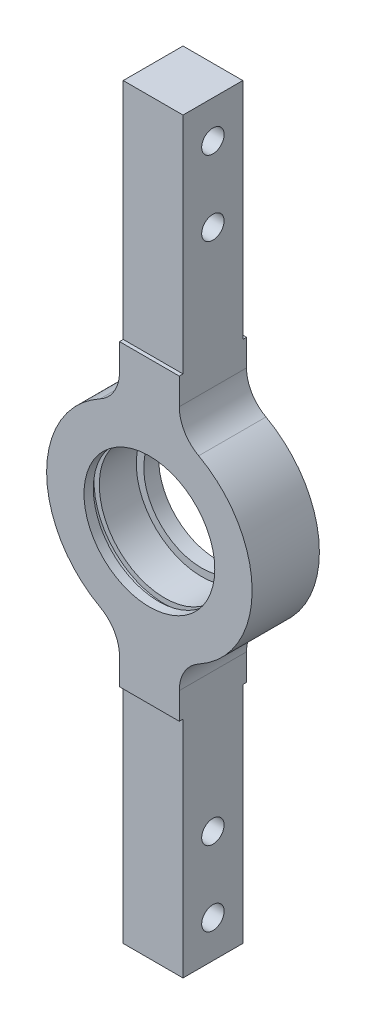
ISO-10303-21;
HEADER;
FILE_DESCRIPTION(('STEP AP214'),'2;1');
FILE_NAME('part.step','',(''),(''),'','','');
FILE_SCHEMA(('AUTOMOTIVE_DESIGN { 1 0 10303 214 1 1 1 1 }'));
ENDSEC;
DATA;
#1=APPLICATION_CONTEXT('core data for automotive mechanical design processes');
#2=APPLICATION_PROTOCOL_DEFINITION('international standard','automotive_design',2000,#1);
#3=PRODUCT_CONTEXT('',#1,'mechanical');
#4=PRODUCT('Part','Part','',(#3));
#5=PRODUCT_RELATED_PRODUCT_CATEGORY('part','',(#4));
#6=PRODUCT_DEFINITION_FORMATION('','',#4);
#7=PRODUCT_DEFINITION_CONTEXT('part definition',#1,'design');
#8=PRODUCT_DEFINITION('design','',#6,#7);
#9=PRODUCT_DEFINITION_SHAPE('','',#8);
#10=(LENGTH_UNIT() NAMED_UNIT(*) SI_UNIT(.MILLI.,.METRE.));
#11=(NAMED_UNIT(*) PLANE_ANGLE_UNIT() SI_UNIT($,.RADIAN.));
#12=(NAMED_UNIT(*) SI_UNIT($,.STERADIAN.) SOLID_ANGLE_UNIT());
#13=UNCERTAINTY_MEASURE_WITH_UNIT(LENGTH_MEASURE(1.E-05),#10,'distance_accuracy_value','');
#14=(GEOMETRIC_REPRESENTATION_CONTEXT(3) GLOBAL_UNCERTAINTY_ASSIGNED_CONTEXT((#13)) GLOBAL_UNIT_ASSIGNED_CONTEXT((#10,
#11,#12)) REPRESENTATION_CONTEXT('',''));
#15=CARTESIAN_POINT('',(0.,0.,0.));
#16=DIRECTION('',(0.,0.,1.));
#17=DIRECTION('',(1.,0.,0.));
#18=AXIS2_PLACEMENT_3D('',#15,#16,#17);
#19=CARTESIAN_POINT('',(8.,100.,9.));
#20=DIRECTION('',(-1.,0.,0.));
#21=DIRECTION('',(0.,-1.,0.));
#22=AXIS2_PLACEMENT_3D('',#19,#20,#21);
#23=PLANE('',#22);
#24=CARTESIAN_POINT('',(8.,70.,0.));
#25=DIRECTION('',(-1.,0.,0.));
#26=DIRECTION('',(0.,-1.,0.));
#27=AXIS2_PLACEMENT_3D('',#24,#25,#26);
#28=CIRCLE('',#27,3.);
#29=CARTESIAN_POINT('',(8.,67.,0.));
#30=VERTEX_POINT('',#29);
#31=EDGE_CURVE('E226',#30,#30,#28,.T.);
#32=ORIENTED_EDGE('',*,*,#31,.T.);
#33=EDGE_LOOP('',(#32));
#34=FACE_BOUND('',#33,.T.);
#35=CARTESIAN_POINT('',(8.,90.,0.));
#36=DIRECTION('',(-1.,0.,0.));
#37=DIRECTION('',(0.,-1.,0.));
#38=AXIS2_PLACEMENT_3D('',#35,#36,#37);
#39=CIRCLE('',#38,3.);
#40=CARTESIAN_POINT('',(8.,87.,0.));
#41=VERTEX_POINT('',#40);
#42=EDGE_CURVE('E232',#41,#41,#39,.T.);
#43=ORIENTED_EDGE('',*,*,#42,.T.);
#44=EDGE_LOOP('',(#43));
#45=FACE_BOUND('',#44,.T.);
#46=DIRECTION('',(0.,1.,0.));
#47=VECTOR('',#46,1.);
#48=CARTESIAN_POINT('',(8.,40.,-8.));
#49=LINE('',#48,#47);
#50=CARTESIAN_POINT('',(8.,40.,-8.));
#51=VERTEX_POINT('',#50);
#52=CARTESIAN_POINT('',(8.,100.,-8.));
#53=VERTEX_POINT('',#52);
#54=EDGE_CURVE('E175',#51,#53,#49,.T.);
#55=ORIENTED_EDGE('',*,*,#54,.T.);
#56=DIRECTION('',(0.,0.,-1.));
#57=VECTOR('',#56,1.);
#58=CARTESIAN_POINT('',(8.,100.,9.));
#59=LINE('',#58,#57);
#60=CARTESIAN_POINT('',(8.,100.,8.));
#61=VERTEX_POINT('',#60);
#62=EDGE_CURVE('E312',#61,#53,#59,.T.);
#63=ORIENTED_EDGE('',*,*,#62,.F.);
#64=DIRECTION('',(0.,1.,0.));
#65=VECTOR('',#64,1.);
#66=CARTESIAN_POINT('',(8.,40.,8.));
#67=LINE('',#66,#65);
#68=CARTESIAN_POINT('',(8.,40.,8.));
#69=VERTEX_POINT('',#68);
#70=EDGE_CURVE('E206',#69,#61,#67,.T.);
#71=ORIENTED_EDGE('',*,*,#70,.F.);
#72=DIRECTION('',(0.,0.,1.));
#73=VECTOR('',#72,1.);
#74=CARTESIAN_POINT('',(8.,40.,9.));
#75=LINE('',#74,#73);
#76=CARTESIAN_POINT('',(8.,40.,9.));
#77=VERTEX_POINT('',#76);
#78=EDGE_CURVE('E201',#69,#77,#75,.T.);
#79=ORIENTED_EDGE('',*,*,#78,.T.);
#80=DIRECTION('',(0.,1.,0.));
#81=VECTOR('',#80,1.);
#82=CARTESIAN_POINT('',(8.,100.,9.));
#83=LINE('',#82,#81);
#84=CARTESIAN_POINT('',(8.00000000000001,32.897568299192,9.));
#85=VERTEX_POINT('',#84);
#86=EDGE_CURVE('E302',#85,#77,#83,.T.);
#87=ORIENTED_EDGE('',*,*,#86,.F.);
#88=DIRECTION('',(0.,0.,1.));
#89=VECTOR('',#88,1.);
#90=CARTESIAN_POINT('',(8.00000000000001,32.897568299192,-9.));
#91=LINE('',#90,#89);
#92=CARTESIAN_POINT('',(8.00000000000001,32.897568299192,-9.));
#93=VERTEX_POINT('',#92);
#94=EDGE_CURVE('E348',#85,#93,#91,.F.);
#95=ORIENTED_EDGE('',*,*,#94,.T.);
#96=DIRECTION('',(0.,1.,0.));
#97=VECTOR('',#96,1.);
#98=CARTESIAN_POINT('',(8.,100.,-9.));
#99=LINE('',#98,#97);
#100=CARTESIAN_POINT('',(8.00000000000001,40.,-9.));
#101=VERTEX_POINT('',#100);
#102=EDGE_CURVE('E301',#93,#101,#99,.T.);
#103=ORIENTED_EDGE('',*,*,#102,.T.);
#104=DIRECTION('',(0.,0.,1.));
#105=VECTOR('',#104,1.);
#106=CARTESIAN_POINT('',(8.,40.,-9.));
#107=LINE('',#106,#105);
#108=EDGE_CURVE('E48',#101,#51,#107,.T.);
#109=ORIENTED_EDGE('',*,*,#108,.T.);
#110=EDGE_LOOP('',(#55,#63,#71,#79,#87,#95,#103,#109));
#111=FACE_BOUND('',#110,.T.);
#112=ADVANCED_FACE('F33',(#34,#45,#111),#23,.F.);
#113=CARTESIAN_POINT('',(-8.,100.,9.));
#114=DIRECTION('',(0.,-1.,0.));
#115=DIRECTION('',(0.,0.,-1.));
#116=AXIS2_PLACEMENT_3D('',#113,#114,#115);
#117=PLANE('',#116);
#118=DIRECTION('',(-1.,0.,0.));
#119=VECTOR('',#118,1.);
#120=CARTESIAN_POINT('',(-8.,100.,-8.));
#121=LINE('',#120,#119);
#122=CARTESIAN_POINT('',(-8.,100.,-8.));
#123=VERTEX_POINT('',#122);
#124=EDGE_CURVE('E183',#53,#123,#121,.T.);
#125=ORIENTED_EDGE('',*,*,#124,.T.);
#126=DIRECTION('',(0.,0.,-1.));
#127=VECTOR('',#126,1.);
#128=CARTESIAN_POINT('',(-8.,100.,9.));
#129=LINE('',#128,#127);
#130=CARTESIAN_POINT('',(-8.,100.,8.));
#131=VERTEX_POINT('',#130);
#132=EDGE_CURVE('E188',#131,#123,#129,.T.);
#133=ORIENTED_EDGE('',*,*,#132,.F.);
#134=DIRECTION('',(1.,0.,0.));
#135=VECTOR('',#134,1.);
#136=CARTESIAN_POINT('',(-8.,100.,8.));
#137=LINE('',#136,#135);
#138=EDGE_CURVE('E190',#131,#61,#137,.T.);
#139=ORIENTED_EDGE('',*,*,#138,.T.);
#140=ORIENTED_EDGE('',*,*,#62,.T.);
#141=EDGE_LOOP('',(#125,#133,#139,#140));
#142=FACE_BOUND('',#141,.T.);
#143=ADVANCED_FACE('F448',(#142),#117,.F.);
#144=CARTESIAN_POINT('',(-8.,100.,9.));
#145=DIRECTION('',(1.,0.,0.));
#146=DIRECTION('',(0.,1.,0.));
#147=AXIS2_PLACEMENT_3D('',#144,#145,#146);
#148=PLANE('',#147);
#149=CARTESIAN_POINT('',(-8.,70.,0.));
#150=DIRECTION('',(-1.,0.,0.));
#151=DIRECTION('',(0.,-1.,0.));
#152=AXIS2_PLACEMENT_3D('',#149,#150,#151);
#153=CIRCLE('',#152,3.);
#154=CARTESIAN_POINT('',(-8.,67.,0.));
#155=VERTEX_POINT('',#154);
#156=EDGE_CURVE('E223',#155,#155,#153,.T.);
#157=ORIENTED_EDGE('',*,*,#156,.F.);
#158=EDGE_LOOP('',(#157));
#159=FACE_BOUND('',#158,.T.);
#160=CARTESIAN_POINT('',(-8.,90.,0.));
#161=DIRECTION('',(-1.,0.,0.));
#162=DIRECTION('',(0.,-1.,0.));
#163=AXIS2_PLACEMENT_3D('',#160,#161,#162);
#164=CIRCLE('',#163,3.);
#165=CARTESIAN_POINT('',(-8.,87.,0.));
#166=VERTEX_POINT('',#165);
#167=EDGE_CURVE('E229',#166,#166,#164,.T.);
#168=ORIENTED_EDGE('',*,*,#167,.F.);
#169=EDGE_LOOP('',(#168));
#170=FACE_BOUND('',#169,.T.);
#171=DIRECTION('',(0.,1.,0.));
#172=VECTOR('',#171,1.);
#173=CARTESIAN_POINT('',(-8.,40.,-8.));
#174=LINE('',#173,#172);
#175=CARTESIAN_POINT('',(-8.,40.,-8.));
#176=VERTEX_POINT('',#175);
#177=EDGE_CURVE('E172',#176,#123,#174,.T.);
#178=ORIENTED_EDGE('',*,*,#177,.F.);
#179=DIRECTION('',(0.,0.,-1.));
#180=VECTOR('',#179,1.);
#181=CARTESIAN_POINT('',(-8.,40.,-9.));
#182=LINE('',#181,#180);
#183=CARTESIAN_POINT('',(-8.,40.,-9.));
#184=VERTEX_POINT('',#183);
#185=EDGE_CURVE('E176',#176,#184,#182,.T.);
#186=ORIENTED_EDGE('',*,*,#185,.T.);
#187=DIRECTION('',(0.,-1.,0.));
#188=VECTOR('',#187,1.);
#189=CARTESIAN_POINT('',(-8.,100.,-9.));
#190=LINE('',#189,#188);
#191=CARTESIAN_POINT('',(-8.00000000000001,32.897568299192,-9.));
#192=VERTEX_POINT('',#191);
#193=EDGE_CURVE('E306',#184,#192,#190,.T.);
#194=ORIENTED_EDGE('',*,*,#193,.T.);
#195=DIRECTION('',(0.,0.,1.));
#196=VECTOR('',#195,1.);
#197=CARTESIAN_POINT('',(-8.00000000000001,32.897568299192,9.));
#198=LINE('',#197,#196);
#199=CARTESIAN_POINT('',(-8.00000000000001,32.897568299192,9.));
#200=VERTEX_POINT('',#199);
#201=EDGE_CURVE('E345',#192,#200,#198,.T.);
#202=ORIENTED_EDGE('',*,*,#201,.T.);
#203=DIRECTION('',(0.,-1.,0.));
#204=VECTOR('',#203,1.);
#205=CARTESIAN_POINT('',(-8.,100.,9.));
#206=LINE('',#205,#204);
#207=CARTESIAN_POINT('',(-8.,40.,9.));
#208=VERTEX_POINT('',#207);
#209=EDGE_CURVE('E305',#208,#200,#206,.T.);
#210=ORIENTED_EDGE('',*,*,#209,.F.);
#211=DIRECTION('',(0.,0.,-1.));
#212=VECTOR('',#211,1.);
#213=CARTESIAN_POINT('',(-8.,40.,9.));
#214=LINE('',#213,#212);
#215=CARTESIAN_POINT('',(-8.00000000000001,40.,8.));
#216=VERTEX_POINT('',#215);
#217=EDGE_CURVE('E195',#208,#216,#214,.T.);
#218=ORIENTED_EDGE('',*,*,#217,.T.);
#219=DIRECTION('',(0.,1.,0.));
#220=VECTOR('',#219,1.);
#221=CARTESIAN_POINT('',(-8.,40.,8.));
#222=LINE('',#221,#220);
#223=EDGE_CURVE('E56',#216,#131,#222,.T.);
#224=ORIENTED_EDGE('',*,*,#223,.T.);
#225=ORIENTED_EDGE('',*,*,#132,.T.);
#226=EDGE_LOOP('',(#178,#186,#194,#202,#210,#218,#224,#225));
#227=FACE_BOUND('',#226,.T.);
#228=ADVANCED_FACE('F186',(#159,#170,#227),#148,.F.);
#229=CARTESIAN_POINT('',(0.,0.,9.));
#230=DIRECTION('',(0.,0.,1.));
#231=DIRECTION('',(1.,0.,0.));
#232=AXIS2_PLACEMENT_3D('',#229,#230,#231);
#233=PLANE('',#232);
#234=CARTESIAN_POINT('',(0.,0.,9.));
#235=DIRECTION('',(0.,0.,1.));
#236=DIRECTION('',(1.,0.,0.));
#237=AXIS2_PLACEMENT_3D('',#234,#235,#236);
#238=CIRCLE('',#237,17.5);
#239=CARTESIAN_POINT('',(17.5,0.,9.));
#240=VERTEX_POINT('',#239);
#241=EDGE_CURVE('E275',#240,#240,#238,.T.);
#242=ORIENTED_EDGE('',*,*,#241,.F.);
#243=EDGE_LOOP('',(#242));
#244=FACE_BOUND('',#243,.T.);
#245=ORIENTED_EDGE('',*,*,#86,.T.);
#246=DIRECTION('',(-1.,0.,0.));
#247=VECTOR('',#246,1.);
#248=CARTESIAN_POINT('',(-8.,40.,9.));
#249=LINE('',#248,#247);
#250=EDGE_CURVE('E198',#77,#208,#249,.T.);
#251=ORIENTED_EDGE('',*,*,#250,.T.);
#252=ORIENTED_EDGE('',*,*,#209,.T.);
#253=CARTESIAN_POINT('',(-18.,32.897568299192,9.));
#254=DIRECTION('',(0.,0.,1.));
#255=DIRECTION('',(1.,0.,0.));
#256=AXIS2_PLACEMENT_3D('',#253,#254,#255);
#257=CIRCLE('',#256,10.);
#258=CARTESIAN_POINT('',(-13.2,24.1248834194074,9.));
#259=VERTEX_POINT('',#258);
#260=EDGE_CURVE('E363',#200,#259,#257,.F.);
#261=ORIENTED_EDGE('',*,*,#260,.T.);
#262=CARTESIAN_POINT('',(0.,0.,9.));
#263=DIRECTION('',(0.,0.,1.));
#264=DIRECTION('',(1.,0.,0.));
#265=AXIS2_PLACEMENT_3D('',#262,#263,#264);
#266=CIRCLE('',#265,27.5);
#267=CARTESIAN_POINT('',(-13.2,-24.1248834194074,9.));
#268=VERTEX_POINT('',#267);
#269=EDGE_CURVE('E319',#259,#268,#266,.T.);
#270=ORIENTED_EDGE('',*,*,#269,.T.);
#271=CARTESIAN_POINT('',(-18.,-32.897568299192,9.));
#272=DIRECTION('',(0.,0.,1.));
#273=DIRECTION('',(1.,0.,0.));
#274=AXIS2_PLACEMENT_3D('',#271,#272,#273);
#275=CIRCLE('',#274,10.);
#276=CARTESIAN_POINT('',(-8.00000000000001,-32.897568299192,9.));
#277=VERTEX_POINT('',#276);
#278=EDGE_CURVE('E357',#268,#277,#275,.F.);
#279=ORIENTED_EDGE('',*,*,#278,.T.);
#280=DIRECTION('',(0.,1.,0.));
#281=VECTOR('',#280,1.);
#282=CARTESIAN_POINT('',(-8.,-100.,9.));
#283=LINE('',#282,#281);
#284=CARTESIAN_POINT('',(-8.,-40.,9.));
#285=VERTEX_POINT('',#284);
#286=EDGE_CURVE('E289',#285,#277,#283,.T.);
#287=ORIENTED_EDGE('',*,*,#286,.F.);
#288=DIRECTION('',(-1.,0.,0.));
#289=VECTOR('',#288,1.);
#290=CARTESIAN_POINT('',(-8.,-40.,9.));
#291=LINE('',#290,#289);
#292=CARTESIAN_POINT('',(8.,-40.,9.));
#293=VERTEX_POINT('',#292);
#294=EDGE_CURVE('E260',#293,#285,#291,.T.);
#295=ORIENTED_EDGE('',*,*,#294,.F.);
#296=DIRECTION('',(0.,-1.,0.));
#297=VECTOR('',#296,1.);
#298=CARTESIAN_POINT('',(8.,-100.,9.));
#299=LINE('',#298,#297);
#300=CARTESIAN_POINT('',(8.00000000000001,-32.897568299192,9.));
#301=VERTEX_POINT('',#300);
#302=EDGE_CURVE('E286',#301,#293,#299,.T.);
#303=ORIENTED_EDGE('',*,*,#302,.F.);
#304=CARTESIAN_POINT('',(18.,-32.897568299192,9.));
#305=DIRECTION('',(0.,0.,1.));
#306=DIRECTION('',(1.,0.,0.));
#307=AXIS2_PLACEMENT_3D('',#304,#305,#306);
#308=CIRCLE('',#307,10.);
#309=CARTESIAN_POINT('',(13.2,-24.1248834194074,9.));
#310=VERTEX_POINT('',#309);
#311=EDGE_CURVE('E353',#301,#310,#308,.F.);
#312=ORIENTED_EDGE('',*,*,#311,.T.);
#313=CARTESIAN_POINT('',(13.2,24.1248834194074,9.));
#314=VERTEX_POINT('',#313);
#315=EDGE_CURVE('E323',#310,#314,#266,.T.);
#316=ORIENTED_EDGE('',*,*,#315,.T.);
#317=CARTESIAN_POINT('',(18.,32.897568299192,9.));
#318=DIRECTION('',(0.,0.,1.));
#319=DIRECTION('',(1.,0.,0.));
#320=AXIS2_PLACEMENT_3D('',#317,#318,#319);
#321=CIRCLE('',#320,10.);
#322=EDGE_CURVE('E11',#314,#85,#321,.F.);
#323=ORIENTED_EDGE('',*,*,#322,.T.);
#324=EDGE_LOOP('',(#245,#251,#252,#261,#270,#279,#287,#295,#303,#312,#316,#323));
#325=FACE_BOUND('',#324,.T.);
#326=ADVANCED_FACE('F381',(#244,#325),#233,.T.);
#327=CARTESIAN_POINT('',(0.,0.,0.));
#328=DIRECTION('',(0.,0.,1.));
#329=DIRECTION('',(1.,0.,0.));
#330=AXIS2_PLACEMENT_3D('',#327,#328,#329);
#331=CYLINDRICAL_SURFACE('',#330,17.5);
#332=CARTESIAN_POINT('',(0.,0.,-5.));
#333=DIRECTION('',(0.,0.,1.));
#334=DIRECTION('',(1.,0.,0.));
#335=AXIS2_PLACEMENT_3D('',#332,#333,#334);
#336=CIRCLE('',#335,17.5);
#337=CARTESIAN_POINT('',(17.5,0.,-5.));
#338=VERTEX_POINT('',#337);
#339=EDGE_CURVE('E278',#338,#338,#336,.T.);
#340=ORIENTED_EDGE('',*,*,#339,.F.);
#341=EDGE_LOOP('',(#340));
#342=FACE_BOUND('',#341,.T.);
#343=CARTESIAN_POINT('',(0.,0.,4.9));
#344=DIRECTION('',(0.,0.,1.));
#345=DIRECTION('',(1.,0.,0.));
#346=AXIS2_PLACEMENT_3D('',#343,#344,#345);
#347=CIRCLE('',#346,17.5);
#348=CARTESIAN_POINT('',(17.5,0.,4.9));
#349=VERTEX_POINT('',#348);
#350=EDGE_CURVE('E279',#349,#349,#347,.T.);
#351=ORIENTED_EDGE('',*,*,#350,.T.);
#352=EDGE_LOOP('',(#351));
#353=FACE_BOUND('',#352,.T.);
#354=ADVANCED_FACE('F466',(#342,#353),#331,.F.);
#355=ORIENTED_EDGE('',*,*,#241,.T.);
#356=EDGE_LOOP('',(#355));
#357=FACE_BOUND('',#356,.T.);
#358=CARTESIAN_POINT('',(0.,0.,6.5));
#359=DIRECTION('',(0.,0.,-1.));
#360=DIRECTION('',(-1.,0.,0.));
#361=AXIS2_PLACEMENT_3D('',#358,#359,#360);
#362=CIRCLE('',#361,17.5);
#363=CARTESIAN_POINT('',(-17.5,0.,6.5));
#364=VERTEX_POINT('',#363);
#365=EDGE_CURVE('E274',#364,#364,#362,.T.);
#366=ORIENTED_EDGE('',*,*,#365,.T.);
#367=EDGE_LOOP('',(#366));
#368=FACE_BOUND('',#367,.T.);
#369=ADVANCED_FACE('F462',(#357,#368),#331,.F.);
#370=CARTESIAN_POINT('',(0.,0.,9.));
#371=DIRECTION('',(0.,0.,-1.));
#372=DIRECTION('',(-1.,0.,0.));
#373=AXIS2_PLACEMENT_3D('',#370,#371,#372);
#374=CYLINDRICAL_SURFACE('',#373,15.5);
#375=CARTESIAN_POINT('',(0.,0.,-9.));
#376=DIRECTION('',(0.,0.,1.));
#377=DIRECTION('',(1.,0.,0.));
#378=AXIS2_PLACEMENT_3D('',#375,#376,#377);
#379=CIRCLE('',#378,15.5);
#380=CARTESIAN_POINT('',(15.5,0.,-9.));
#381=VERTEX_POINT('',#380);
#382=EDGE_CURVE('E315',#381,#381,#379,.T.);
#383=ORIENTED_EDGE('',*,*,#382,.F.);
#384=EDGE_LOOP('',(#383));
#385=FACE_BOUND('',#384,.T.);
#386=CARTESIAN_POINT('',(0.,0.,-5.));
#387=DIRECTION('',(0.,0.,1.));
#388=DIRECTION('',(1.,0.,0.));
#389=AXIS2_PLACEMENT_3D('',#386,#387,#388);
#390=CIRCLE('',#389,15.5);
#391=CARTESIAN_POINT('',(15.5,0.,-5.));
#392=VERTEX_POINT('',#391);
#393=EDGE_CURVE('E282',#392,#392,#390,.T.);
#394=ORIENTED_EDGE('',*,*,#393,.T.);
#395=EDGE_LOOP('',(#394));
#396=FACE_BOUND('',#395,.T.);
#397=ADVANCED_FACE('F459',(#385,#396),#374,.F.);
#398=CARTESIAN_POINT('',(0.,0.,9.));
#399=DIRECTION('',(0.,0.,-1.));
#400=DIRECTION('',(-1.,0.,0.));
#401=AXIS2_PLACEMENT_3D('',#398,#399,#400);
#402=CYLINDRICAL_SURFACE('',#401,27.5);
#403=ORIENTED_EDGE('',*,*,#315,.F.);
#404=DIRECTION('',(0.,0.,-1.));
#405=VECTOR('',#404,1.);
#406=CARTESIAN_POINT('',(13.2,-24.1248834194074,9.));
#407=LINE('',#406,#405);
#408=CARTESIAN_POINT('',(13.2,-24.1248834194074,-9.));
#409=VERTEX_POINT('',#408);
#410=EDGE_CURVE('E332',#310,#409,#407,.T.);
#411=ORIENTED_EDGE('',*,*,#410,.T.);
#412=CARTESIAN_POINT('',(0.,0.,-9.));
#413=DIRECTION('',(0.,0.,1.));
#414=DIRECTION('',(1.,0.,0.));
#415=AXIS2_PLACEMENT_3D('',#412,#413,#414);
#416=CIRCLE('',#415,27.5);
#417=CARTESIAN_POINT('',(13.2,24.1248834194074,-9.));
#418=VERTEX_POINT('',#417);
#419=EDGE_CURVE('E318',#409,#418,#416,.T.);
#420=ORIENTED_EDGE('',*,*,#419,.T.);
#421=DIRECTION('',(0.,0.,-1.));
#422=VECTOR('',#421,1.);
#423=CARTESIAN_POINT('',(13.2,24.1248834194074,9.));
#424=LINE('',#423,#422);
#425=EDGE_CURVE('E322',#418,#314,#424,.F.);
#426=ORIENTED_EDGE('',*,*,#425,.T.);
#427=EDGE_LOOP('',(#403,#411,#420,#426));
#428=FACE_BOUND('',#427,.T.);
#429=ADVANCED_FACE('F375',(#428),#402,.T.);
#430=CARTESIAN_POINT('',(-13.2,24.1248834194074,-9.));
#431=VERTEX_POINT('',#430);
#432=CARTESIAN_POINT('',(-13.2,-24.1248834194074,-9.));
#433=VERTEX_POINT('',#432);
#434=EDGE_CURVE('E324',#431,#433,#416,.T.);
#435=ORIENTED_EDGE('',*,*,#434,.T.);
#436=DIRECTION('',(0.,0.,-1.));
#437=VECTOR('',#436,1.);
#438=CARTESIAN_POINT('',(-13.2,-24.1248834194074,9.));
#439=LINE('',#438,#437);
#440=EDGE_CURVE('E343',#433,#268,#439,.F.);
#441=ORIENTED_EDGE('',*,*,#440,.T.);
#442=ORIENTED_EDGE('',*,*,#269,.F.);
#443=DIRECTION('',(0.,0.,-1.));
#444=VECTOR('',#443,1.);
#445=CARTESIAN_POINT('',(-13.2,24.1248834194074,9.));
#446=LINE('',#445,#444);
#447=EDGE_CURVE('E340',#259,#431,#446,.T.);
#448=ORIENTED_EDGE('',*,*,#447,.T.);
#449=EDGE_LOOP('',(#435,#441,#442,#448));
#450=FACE_BOUND('',#449,.T.);
#451=ADVANCED_FACE('F397',(#450),#402,.T.);
#452=CARTESIAN_POINT('',(0.,0.,-9.));
#453=DIRECTION('',(0.,0.,1.));
#454=DIRECTION('',(1.,0.,0.));
#455=AXIS2_PLACEMENT_3D('',#452,#453,#454);
#456=PLANE('',#455);
#457=ORIENTED_EDGE('',*,*,#193,.F.);
#458=DIRECTION('',(1.,0.,0.));
#459=VECTOR('',#458,1.);
#460=CARTESIAN_POINT('',(-8.,40.,-9.));
#461=LINE('',#460,#459);
#462=EDGE_CURVE('E180',#184,#101,#461,.T.);
#463=ORIENTED_EDGE('',*,*,#462,.T.);
#464=ORIENTED_EDGE('',*,*,#102,.F.);
#465=CARTESIAN_POINT('',(18.,32.897568299192,-9.));
#466=DIRECTION('',(0.,0.,1.));
#467=DIRECTION('',(1.,0.,0.));
#468=AXIS2_PLACEMENT_3D('',#465,#466,#467);
#469=CIRCLE('',#468,10.);
#470=EDGE_CURVE('E41',#93,#418,#469,.T.);
#471=ORIENTED_EDGE('',*,*,#470,.T.);
#472=ORIENTED_EDGE('',*,*,#419,.F.);
#473=CARTESIAN_POINT('',(18.,-32.897568299192,-9.));
#474=DIRECTION('',(0.,0.,1.));
#475=DIRECTION('',(1.,0.,0.));
#476=AXIS2_PLACEMENT_3D('',#473,#474,#475);
#477=CIRCLE('',#476,10.);
#478=CARTESIAN_POINT('',(8.00000000000001,-32.897568299192,-9.));
#479=VERTEX_POINT('',#478);
#480=EDGE_CURVE('E351',#409,#479,#477,.T.);
#481=ORIENTED_EDGE('',*,*,#480,.T.);
#482=DIRECTION('',(0.,-1.,0.));
#483=VECTOR('',#482,1.);
#484=CARTESIAN_POINT('',(8.,-100.,-9.));
#485=LINE('',#484,#483);
#486=CARTESIAN_POINT('',(8.,-40.,-9.));
#487=VERTEX_POINT('',#486);
#488=EDGE_CURVE('E285',#479,#487,#485,.T.);
#489=ORIENTED_EDGE('',*,*,#488,.T.);
#490=DIRECTION('',(1.,0.,0.));
#491=VECTOR('',#490,1.);
#492=CARTESIAN_POINT('',(-8.,-40.,-9.));
#493=LINE('',#492,#491);
#494=CARTESIAN_POINT('',(-8.,-40.,-9.));
#495=VERTEX_POINT('',#494);
#496=EDGE_CURVE('E238',#495,#487,#493,.T.);
#497=ORIENTED_EDGE('',*,*,#496,.F.);
#498=DIRECTION('',(0.,1.,0.));
#499=VECTOR('',#498,1.);
#500=CARTESIAN_POINT('',(-8.,-100.,-9.));
#501=LINE('',#500,#499);
#502=CARTESIAN_POINT('',(-8.00000000000001,-32.897568299192,-9.));
#503=VERTEX_POINT('',#502);
#504=EDGE_CURVE('E290',#495,#503,#501,.T.);
#505=ORIENTED_EDGE('',*,*,#504,.T.);
#506=CARTESIAN_POINT('',(-18.,-32.897568299192,-9.));
#507=DIRECTION('',(0.,0.,1.));
#508=DIRECTION('',(1.,0.,0.));
#509=AXIS2_PLACEMENT_3D('',#506,#507,#508);
#510=CIRCLE('',#509,10.);
#511=EDGE_CURVE('E355',#503,#433,#510,.T.);
#512=ORIENTED_EDGE('',*,*,#511,.T.);
#513=ORIENTED_EDGE('',*,*,#434,.F.);
#514=CARTESIAN_POINT('',(-18.,32.897568299192,-9.));
#515=DIRECTION('',(0.,0.,1.));
#516=DIRECTION('',(1.,0.,0.));
#517=AXIS2_PLACEMENT_3D('',#514,#515,#516);
#518=CIRCLE('',#517,10.);
#519=EDGE_CURVE('E360',#431,#192,#518,.T.);
#520=ORIENTED_EDGE('',*,*,#519,.T.);
#521=EDGE_LOOP('',(#457,#463,#464,#471,#472,#481,#489,#497,#505,#512,#513,#520));
#522=FACE_BOUND('',#521,.T.);
#523=ORIENTED_EDGE('',*,*,#382,.T.);
#524=EDGE_LOOP('',(#523));
#525=FACE_BOUND('',#524,.T.);
#526=ADVANCED_FACE('F368',(#522,#525),#456,.F.);
#527=CARTESIAN_POINT('',(8.,-100.,9.));
#528=DIRECTION('',(1.,0.,0.));
#529=DIRECTION('',(0.,1.,0.));
#530=AXIS2_PLACEMENT_3D('',#527,#528,#529);
#531=PLANE('',#530);
#532=CARTESIAN_POINT('',(8.,-70.,0.));
#533=DIRECTION('',(1.,0.,0.));
#534=DIRECTION('',(0.,1.,0.));
#535=AXIS2_PLACEMENT_3D('',#532,#533,#534);
#536=CIRCLE('',#535,3.);
#537=CARTESIAN_POINT('',(8.,-67.,0.));
#538=VERTEX_POINT('',#537);
#539=EDGE_CURVE('E214',#538,#538,#536,.T.);
#540=ORIENTED_EDGE('',*,*,#539,.F.);
#541=EDGE_LOOP('',(#540));
#542=FACE_BOUND('',#541,.T.);
#543=CARTESIAN_POINT('',(8.,-90.,0.));
#544=DIRECTION('',(1.,0.,0.));
#545=DIRECTION('',(0.,1.,0.));
#546=AXIS2_PLACEMENT_3D('',#543,#544,#545);
#547=CIRCLE('',#546,3.);
#548=CARTESIAN_POINT('',(8.,-87.,0.));
#549=VERTEX_POINT('',#548);
#550=EDGE_CURVE('E220',#549,#549,#547,.T.);
#551=ORIENTED_EDGE('',*,*,#550,.F.);
#552=EDGE_LOOP('',(#551));
#553=FACE_BOUND('',#552,.T.);
#554=DIRECTION('',(0.,-1.,0.));
#555=VECTOR('',#554,1.);
#556=CARTESIAN_POINT('',(8.,-40.,-8.));
#557=LINE('',#556,#555);
#558=CARTESIAN_POINT('',(8.,-40.,-8.));
#559=VERTEX_POINT('',#558);
#560=CARTESIAN_POINT('',(8.,-100.,-8.));
#561=VERTEX_POINT('',#560);
#562=EDGE_CURVE('E245',#559,#561,#557,.T.);
#563=ORIENTED_EDGE('',*,*,#562,.F.);
#564=DIRECTION('',(0.,0.,1.));
#565=VECTOR('',#564,1.);
#566=CARTESIAN_POINT('',(8.,-40.,-9.));
#567=LINE('',#566,#565);
#568=EDGE_CURVE('E240',#487,#559,#567,.T.);
#569=ORIENTED_EDGE('',*,*,#568,.F.);
#570=ORIENTED_EDGE('',*,*,#488,.F.);
#571=DIRECTION('',(0.,0.,-1.));
#572=VECTOR('',#571,1.);
#573=CARTESIAN_POINT('',(8.00000000000001,-32.897568299192,9.));
#574=LINE('',#573,#572);
#575=EDGE_CURVE('E335',#479,#301,#574,.F.);
#576=ORIENTED_EDGE('',*,*,#575,.T.);
#577=ORIENTED_EDGE('',*,*,#302,.T.);
#578=DIRECTION('',(0.,0.,1.));
#579=VECTOR('',#578,1.);
#580=CARTESIAN_POINT('',(8.,-40.,9.));
#581=LINE('',#580,#579);
#582=CARTESIAN_POINT('',(8.,-40.,8.));
#583=VERTEX_POINT('',#582);
#584=EDGE_CURVE('E258',#583,#293,#581,.T.);
#585=ORIENTED_EDGE('',*,*,#584,.F.);
#586=DIRECTION('',(0.,-1.,0.));
#587=VECTOR('',#586,1.);
#588=CARTESIAN_POINT('',(8.,-40.,8.));
#589=LINE('',#588,#587);
#590=CARTESIAN_POINT('',(8.,-100.,8.));
#591=VERTEX_POINT('',#590);
#592=EDGE_CURVE('E264',#583,#591,#589,.T.);
#593=ORIENTED_EDGE('',*,*,#592,.T.);
#594=DIRECTION('',(0.,0.,-1.));
#595=VECTOR('',#594,1.);
#596=CARTESIAN_POINT('',(8.,-100.,9.));
#597=LINE('',#596,#595);
#598=EDGE_CURVE('E292',#591,#561,#597,.T.);
#599=ORIENTED_EDGE('',*,*,#598,.T.);
#600=EDGE_LOOP('',(#563,#569,#570,#576,#577,#585,#593,#599));
#601=FACE_BOUND('',#600,.T.);
#602=ADVANCED_FACE('F418',(#542,#553,#601),#531,.T.);
#603=CARTESIAN_POINT('',(-8.,-100.,9.));
#604=DIRECTION('',(-1.,0.,0.));
#605=DIRECTION('',(0.,-1.,0.));
#606=AXIS2_PLACEMENT_3D('',#603,#604,#605);
#607=PLANE('',#606);
#608=CARTESIAN_POINT('',(-8.,-70.,0.));
#609=DIRECTION('',(-1.,0.,0.));
#610=DIRECTION('',(0.,-1.,0.));
#611=AXIS2_PLACEMENT_3D('',#608,#609,#610);
#612=CIRCLE('',#611,3.);
#613=CARTESIAN_POINT('',(-8.,-73.,0.));
#614=VERTEX_POINT('',#613);
#615=EDGE_CURVE('E210',#614,#614,#612,.T.);
#616=ORIENTED_EDGE('',*,*,#615,.F.);
#617=EDGE_LOOP('',(#616));
#618=FACE_BOUND('',#617,.T.);
#619=CARTESIAN_POINT('',(-8.,-90.,0.));
#620=DIRECTION('',(-1.,0.,0.));
#621=DIRECTION('',(0.,-1.,0.));
#622=AXIS2_PLACEMENT_3D('',#619,#620,#621);
#623=CIRCLE('',#622,3.);
#624=CARTESIAN_POINT('',(-8.,-93.,0.));
#625=VERTEX_POINT('',#624);
#626=EDGE_CURVE('E217',#625,#625,#623,.T.);
#627=ORIENTED_EDGE('',*,*,#626,.F.);
#628=EDGE_LOOP('',(#627));
#629=FACE_BOUND('',#628,.T.);
#630=DIRECTION('',(0.,-1.,0.));
#631=VECTOR('',#630,1.);
#632=CARTESIAN_POINT('',(-8.,-40.,-8.));
#633=LINE('',#632,#631);
#634=CARTESIAN_POINT('',(-8.,-40.,-8.));
#635=VERTEX_POINT('',#634);
#636=CARTESIAN_POINT('',(-8.,-100.,-8.));
#637=VERTEX_POINT('',#636);
#638=EDGE_CURVE('E247',#635,#637,#633,.T.);
#639=ORIENTED_EDGE('',*,*,#638,.T.);
#640=DIRECTION('',(0.,0.,-1.));
#641=VECTOR('',#640,1.);
#642=CARTESIAN_POINT('',(-8.,-100.,9.));
#643=LINE('',#642,#641);
#644=CARTESIAN_POINT('',(-8.,-100.,8.));
#645=VERTEX_POINT('',#644);
#646=EDGE_CURVE('E298',#645,#637,#643,.T.);
#647=ORIENTED_EDGE('',*,*,#646,.F.);
#648=DIRECTION('',(0.,-1.,0.));
#649=VECTOR('',#648,1.);
#650=CARTESIAN_POINT('',(-8.,-40.,8.));
#651=LINE('',#650,#649);
#652=CARTESIAN_POINT('',(-8.,-40.,8.));
#653=VERTEX_POINT('',#652);
#654=EDGE_CURVE('E262',#653,#645,#651,.T.);
#655=ORIENTED_EDGE('',*,*,#654,.F.);
#656=DIRECTION('',(0.,0.,-1.));
#657=VECTOR('',#656,1.);
#658=CARTESIAN_POINT('',(-8.,-40.,9.));
#659=LINE('',#658,#657);
#660=EDGE_CURVE('E252',#285,#653,#659,.T.);
#661=ORIENTED_EDGE('',*,*,#660,.F.);
#662=ORIENTED_EDGE('',*,*,#286,.T.);
#663=DIRECTION('',(0.,0.,-1.));
#664=VECTOR('',#663,1.);
#665=CARTESIAN_POINT('',(-8.00000000000001,-32.897568299192,9.));
#666=LINE('',#665,#664);
#667=EDGE_CURVE('E337',#277,#503,#666,.T.);
#668=ORIENTED_EDGE('',*,*,#667,.T.);
#669=ORIENTED_EDGE('',*,*,#504,.F.);
#670=DIRECTION('',(0.,0.,-1.));
#671=VECTOR('',#670,1.);
#672=CARTESIAN_POINT('',(-8.,-40.,-9.));
#673=LINE('',#672,#671);
#674=EDGE_CURVE('E236',#635,#495,#673,.T.);
#675=ORIENTED_EDGE('',*,*,#674,.F.);
#676=EDGE_LOOP('',(#639,#647,#655,#661,#662,#668,#669,#675));
#677=FACE_BOUND('',#676,.T.);
#678=ADVANCED_FACE('F409',(#618,#629,#677),#607,.T.);
#679=CARTESIAN_POINT('',(-8.,-100.,9.));
#680=DIRECTION('',(0.,-1.,0.));
#681=DIRECTION('',(0.,0.,-1.));
#682=AXIS2_PLACEMENT_3D('',#679,#680,#681);
#683=PLANE('',#682);
#684=DIRECTION('',(-1.,0.,0.));
#685=VECTOR('',#684,1.);
#686=CARTESIAN_POINT('',(-8.,-100.,-8.));
#687=LINE('',#686,#685);
#688=EDGE_CURVE('E235',#561,#637,#687,.T.);
#689=ORIENTED_EDGE('',*,*,#688,.F.);
#690=ORIENTED_EDGE('',*,*,#598,.F.);
#691=DIRECTION('',(1.,0.,0.));
#692=VECTOR('',#691,1.);
#693=CARTESIAN_POINT('',(-8.,-100.,8.));
#694=LINE('',#693,#692);
#695=EDGE_CURVE('E250',#645,#591,#694,.T.);
#696=ORIENTED_EDGE('',*,*,#695,.F.);
#697=ORIENTED_EDGE('',*,*,#646,.T.);
#698=EDGE_LOOP('',(#689,#690,#696,#697));
#699=FACE_BOUND('',#698,.T.);
#700=ADVANCED_FACE('F436',(#699),#683,.T.);
#701=CARTESIAN_POINT('',(0.,15.5,-5.));
#702=DIRECTION('',(0.,0.,1.));
#703=DIRECTION('',(1.,0.,0.));
#704=AXIS2_PLACEMENT_3D('',#701,#702,#703);
#705=PLANE('',#704);
#706=ORIENTED_EDGE('',*,*,#339,.T.);
#707=EDGE_LOOP('',(#706));
#708=FACE_BOUND('',#707,.T.);
#709=ORIENTED_EDGE('',*,*,#393,.F.);
#710=EDGE_LOOP('',(#709));
#711=FACE_BOUND('',#710,.T.);
#712=ADVANCED_FACE('F494',(#708,#711),#705,.T.);
#713=CARTESIAN_POINT('',(0.,17.,4.9));
#714=DIRECTION('',(0.,0.,1.));
#715=DIRECTION('',(1.,0.,0.));
#716=AXIS2_PLACEMENT_3D('',#713,#714,#715);
#717=PLANE('',#716);
#718=ORIENTED_EDGE('',*,*,#350,.F.);
#719=EDGE_LOOP('',(#718));
#720=FACE_BOUND('',#719,.T.);
#721=CARTESIAN_POINT('',(0.,0.,4.9));
#722=DIRECTION('',(0.,0.,1.));
#723=DIRECTION('',(1.,0.,0.));
#724=AXIS2_PLACEMENT_3D('',#721,#722,#723);
#725=CIRCLE('',#724,18.9);
#726=CARTESIAN_POINT('',(18.9,0.,4.9));
#727=VERTEX_POINT('',#726);
#728=EDGE_CURVE('E271',#727,#727,#725,.T.);
#729=ORIENTED_EDGE('',*,*,#728,.T.);
#730=EDGE_LOOP('',(#729));
#731=FACE_BOUND('',#730,.T.);
#732=ADVANCED_FACE('F685',(#720,#731),#717,.T.);
#733=CARTESIAN_POINT('',(0.,0.,0.));
#734=DIRECTION('',(0.,0.,1.));
#735=DIRECTION('',(1.,0.,0.));
#736=AXIS2_PLACEMENT_3D('',#733,#734,#735);
#737=CYLINDRICAL_SURFACE('',#736,18.9);
#738=CARTESIAN_POINT('',(0.,0.,6.5));
#739=DIRECTION('',(0.,0.,1.));
#740=DIRECTION('',(1.,0.,0.));
#741=AXIS2_PLACEMENT_3D('',#738,#739,#740);
#742=CIRCLE('',#741,18.9);
#743=CARTESIAN_POINT('',(18.9,0.,6.5));
#744=VERTEX_POINT('',#743);
#745=EDGE_CURVE('E267',#744,#744,#742,.T.);
#746=ORIENTED_EDGE('',*,*,#745,.T.);
#747=EDGE_LOOP('',(#746));
#748=FACE_BOUND('',#747,.T.);
#749=ORIENTED_EDGE('',*,*,#728,.F.);
#750=EDGE_LOOP('',(#749));
#751=FACE_BOUND('',#750,.T.);
#752=ADVANCED_FACE('F694',(#748,#751),#737,.F.);
#753=CARTESIAN_POINT('',(0.,18.9,6.5));
#754=DIRECTION('',(0.,0.,-1.));
#755=DIRECTION('',(-1.,0.,0.));
#756=AXIS2_PLACEMENT_3D('',#753,#754,#755);
#757=PLANE('',#756);
#758=ORIENTED_EDGE('',*,*,#365,.F.);
#759=EDGE_LOOP('',(#758));
#760=FACE_BOUND('',#759,.T.);
#761=ORIENTED_EDGE('',*,*,#745,.F.);
#762=EDGE_LOOP('',(#761));
#763=FACE_BOUND('',#762,.T.);
#764=ADVANCED_FACE('F474',(#760,#763),#757,.T.);
#765=CARTESIAN_POINT('',(18.,-32.897568299192,9.));
#766=DIRECTION('',(0.,0.,-1.));
#767=DIRECTION('',(-1.,0.,0.));
#768=AXIS2_PLACEMENT_3D('',#765,#766,#767);
#769=CYLINDRICAL_SURFACE('',#768,10.);
#770=ORIENTED_EDGE('',*,*,#311,.F.);
#771=ORIENTED_EDGE('',*,*,#575,.F.);
#772=ORIENTED_EDGE('',*,*,#480,.F.);
#773=ORIENTED_EDGE('',*,*,#410,.F.);
#774=EDGE_LOOP('',(#770,#771,#772,#773));
#775=FACE_BOUND('',#774,.T.);
#776=ADVANCED_FACE('F424',(#775),#769,.F.);
#777=CARTESIAN_POINT('',(-18.,-32.897568299192,9.));
#778=DIRECTION('',(0.,0.,-1.));
#779=DIRECTION('',(-1.,0.,0.));
#780=AXIS2_PLACEMENT_3D('',#777,#778,#779);
#781=CYLINDRICAL_SURFACE('',#780,10.);
#782=ORIENTED_EDGE('',*,*,#278,.F.);
#783=ORIENTED_EDGE('',*,*,#440,.F.);
#784=ORIENTED_EDGE('',*,*,#511,.F.);
#785=ORIENTED_EDGE('',*,*,#667,.F.);
#786=EDGE_LOOP('',(#782,#783,#784,#785));
#787=FACE_BOUND('',#786,.T.);
#788=ADVANCED_FACE('F402',(#787),#781,.F.);
#789=CARTESIAN_POINT('',(-18.,32.897568299192,9.));
#790=DIRECTION('',(0.,0.,-1.));
#791=DIRECTION('',(-1.,0.,0.));
#792=AXIS2_PLACEMENT_3D('',#789,#790,#791);
#793=CYLINDRICAL_SURFACE('',#792,10.);
#794=ORIENTED_EDGE('',*,*,#260,.F.);
#795=ORIENTED_EDGE('',*,*,#201,.F.);
#796=ORIENTED_EDGE('',*,*,#519,.F.);
#797=ORIENTED_EDGE('',*,*,#447,.F.);
#798=EDGE_LOOP('',(#794,#795,#796,#797));
#799=FACE_BOUND('',#798,.T.);
#800=ADVANCED_FACE('F393',(#799),#793,.F.);
#801=CARTESIAN_POINT('',(18.,32.897568299192,9.));
#802=DIRECTION('',(0.,0.,-1.));
#803=DIRECTION('',(-1.,0.,0.));
#804=AXIS2_PLACEMENT_3D('',#801,#802,#803);
#805=CYLINDRICAL_SURFACE('',#804,10.);
#806=ORIENTED_EDGE('',*,*,#322,.F.);
#807=ORIENTED_EDGE('',*,*,#425,.F.);
#808=ORIENTED_EDGE('',*,*,#470,.F.);
#809=ORIENTED_EDGE('',*,*,#94,.F.);
#810=EDGE_LOOP('',(#806,#807,#808,#809));
#811=FACE_BOUND('',#810,.T.);
#812=ADVANCED_FACE('F35',(#811),#805,.F.);
#813=CARTESIAN_POINT('',(-8.,-40.,8.));
#814=DIRECTION('',(0.,0.,-1.));
#815=DIRECTION('',(-1.,0.,0.));
#816=AXIS2_PLACEMENT_3D('',#813,#814,#815);
#817=PLANE('',#816);
#818=ORIENTED_EDGE('',*,*,#695,.T.);
#819=ORIENTED_EDGE('',*,*,#592,.F.);
#820=DIRECTION('',(1.,0.,0.));
#821=VECTOR('',#820,1.);
#822=CARTESIAN_POINT('',(-8.,-40.,8.));
#823=LINE('',#822,#821);
#824=EDGE_CURVE('E255',#653,#583,#823,.T.);
#825=ORIENTED_EDGE('',*,*,#824,.F.);
#826=ORIENTED_EDGE('',*,*,#654,.T.);
#827=EDGE_LOOP('',(#818,#819,#825,#826));
#828=FACE_BOUND('',#827,.T.);
#829=ADVANCED_FACE('F438',(#828),#817,.F.);
#830=CARTESIAN_POINT('',(0.,-40.,0.));
#831=DIRECTION('',(0.,-1.,0.));
#832=DIRECTION('',(0.,0.,-1.));
#833=AXIS2_PLACEMENT_3D('',#830,#831,#832);
#834=PLANE('',#833);
#835=ORIENTED_EDGE('',*,*,#660,.T.);
#836=ORIENTED_EDGE('',*,*,#824,.T.);
#837=ORIENTED_EDGE('',*,*,#584,.T.);
#838=ORIENTED_EDGE('',*,*,#294,.T.);
#839=EDGE_LOOP('',(#835,#836,#837,#838));
#840=FACE_BOUND('',#839,.T.);
#841=ADVANCED_FACE('F414',(#840),#834,.T.);
#842=CARTESIAN_POINT('',(-8.,-40.,-8.));
#843=DIRECTION('',(0.,0.,1.));
#844=DIRECTION('',(1.,0.,0.));
#845=AXIS2_PLACEMENT_3D('',#842,#843,#844);
#846=PLANE('',#845);
#847=ORIENTED_EDGE('',*,*,#688,.T.);
#848=ORIENTED_EDGE('',*,*,#638,.F.);
#849=DIRECTION('',(-1.,0.,0.));
#850=VECTOR('',#849,1.);
#851=CARTESIAN_POINT('',(-8.,-40.,-8.));
#852=LINE('',#851,#850);
#853=EDGE_CURVE('E242',#559,#635,#852,.T.);
#854=ORIENTED_EDGE('',*,*,#853,.F.);
#855=ORIENTED_EDGE('',*,*,#562,.T.);
#856=EDGE_LOOP('',(#847,#848,#854,#855));
#857=FACE_BOUND('',#856,.T.);
#858=ADVANCED_FACE('F432',(#857),#846,.F.);
#859=CARTESIAN_POINT('',(0.,-40.,0.));
#860=DIRECTION('',(0.,1.,0.));
#861=DIRECTION('',(0.,0.,1.));
#862=AXIS2_PLACEMENT_3D('',#859,#860,#861);
#863=PLANE('',#862);
#864=ORIENTED_EDGE('',*,*,#674,.T.);
#865=ORIENTED_EDGE('',*,*,#496,.T.);
#866=ORIENTED_EDGE('',*,*,#568,.T.);
#867=ORIENTED_EDGE('',*,*,#853,.T.);
#868=EDGE_LOOP('',(#864,#865,#866,#867));
#869=FACE_BOUND('',#868,.T.);
#870=ADVANCED_FACE('F429',(#869),#863,.F.);
#871=CARTESIAN_POINT('',(27.5,90.,0.));
#872=DIRECTION('',(-1.,0.,0.));
#873=DIRECTION('',(0.,-1.,0.));
#874=AXIS2_PLACEMENT_3D('',#871,#872,#873);
#875=CYLINDRICAL_SURFACE('',#874,3.);
#876=ORIENTED_EDGE('',*,*,#167,.T.);
#877=EDGE_LOOP('',(#876));
#878=FACE_BOUND('',#877,.T.);
#879=ORIENTED_EDGE('',*,*,#42,.F.);
#880=EDGE_LOOP('',(#879));
#881=FACE_BOUND('',#880,.T.);
#882=ADVANCED_FACE('F525',(#878,#881),#875,.F.);
#883=CARTESIAN_POINT('',(27.5,70.,0.));
#884=DIRECTION('',(-1.,0.,0.));
#885=DIRECTION('',(0.,-1.,0.));
#886=AXIS2_PLACEMENT_3D('',#883,#884,#885);
#887=CYLINDRICAL_SURFACE('',#886,3.);
#888=ORIENTED_EDGE('',*,*,#156,.T.);
#889=EDGE_LOOP('',(#888));
#890=FACE_BOUND('',#889,.T.);
#891=ORIENTED_EDGE('',*,*,#31,.F.);
#892=EDGE_LOOP('',(#891));
#893=FACE_BOUND('',#892,.T.);
#894=ADVANCED_FACE('F534',(#890,#893),#887,.F.);
#895=CARTESIAN_POINT('',(27.5,-90.,0.));
#896=DIRECTION('',(-1.,0.,0.));
#897=DIRECTION('',(0.,-1.,0.));
#898=AXIS2_PLACEMENT_3D('',#895,#896,#897);
#899=CYLINDRICAL_SURFACE('',#898,3.);
#900=ORIENTED_EDGE('',*,*,#550,.T.);
#901=EDGE_LOOP('',(#900));
#902=FACE_BOUND('',#901,.T.);
#903=ORIENTED_EDGE('',*,*,#626,.T.);
#904=EDGE_LOOP('',(#903));
#905=FACE_BOUND('',#904,.T.);
#906=ADVANCED_FACE('F544',(#902,#905),#899,.F.);
#907=CARTESIAN_POINT('',(27.5,-70.,0.));
#908=DIRECTION('',(-1.,0.,0.));
#909=DIRECTION('',(0.,-1.,0.));
#910=AXIS2_PLACEMENT_3D('',#907,#908,#909);
#911=CYLINDRICAL_SURFACE('',#910,3.);
#912=ORIENTED_EDGE('',*,*,#539,.T.);
#913=EDGE_LOOP('',(#912));
#914=FACE_BOUND('',#913,.T.);
#915=ORIENTED_EDGE('',*,*,#615,.T.);
#916=EDGE_LOOP('',(#915));
#917=FACE_BOUND('',#916,.T.);
#918=ADVANCED_FACE('F571',(#914,#917),#911,.F.);
#919=CARTESIAN_POINT('',(-8.,40.,8.));
#920=DIRECTION('',(0.,0.,1.));
#921=DIRECTION('',(1.,0.,0.));
#922=AXIS2_PLACEMENT_3D('',#919,#920,#921);
#923=PLANE('',#922);
#924=ORIENTED_EDGE('',*,*,#138,.F.);
#925=ORIENTED_EDGE('',*,*,#223,.F.);
#926=DIRECTION('',(1.,0.,0.));
#927=VECTOR('',#926,1.);
#928=CARTESIAN_POINT('',(-8.,40.,8.));
#929=LINE('',#928,#927);
#930=EDGE_CURVE('E204',#216,#69,#929,.T.);
#931=ORIENTED_EDGE('',*,*,#930,.T.);
#932=ORIENTED_EDGE('',*,*,#70,.T.);
#933=EDGE_LOOP('',(#924,#925,#931,#932));
#934=FACE_BOUND('',#933,.T.);
#935=ADVANCED_FACE('F580',(#934),#923,.T.);
#936=CARTESIAN_POINT('',(0.,40.,0.));
#937=DIRECTION('',(0.,1.,0.));
#938=DIRECTION('',(0.,0.,-1.));
#939=AXIS2_PLACEMENT_3D('',#936,#937,#938);
#940=PLANE('',#939);
#941=ORIENTED_EDGE('',*,*,#217,.F.);
#942=ORIENTED_EDGE('',*,*,#250,.F.);
#943=ORIENTED_EDGE('',*,*,#78,.F.);
#944=ORIENTED_EDGE('',*,*,#930,.F.);
#945=EDGE_LOOP('',(#941,#942,#943,#944));
#946=FACE_BOUND('',#945,.T.);
#947=ADVANCED_FACE('F387',(#946),#940,.T.);
#948=CARTESIAN_POINT('',(-8.,40.,-8.));
#949=DIRECTION('',(0.,0.,-1.));
#950=DIRECTION('',(-1.,0.,0.));
#951=AXIS2_PLACEMENT_3D('',#948,#949,#950);
#952=PLANE('',#951);
#953=ORIENTED_EDGE('',*,*,#124,.F.);
#954=ORIENTED_EDGE('',*,*,#54,.F.);
#955=DIRECTION('',(-1.,0.,0.));
#956=VECTOR('',#955,1.);
#957=CARTESIAN_POINT('',(-8.,40.,-8.));
#958=LINE('',#957,#956);
#959=EDGE_CURVE('E168',#51,#176,#958,.T.);
#960=ORIENTED_EDGE('',*,*,#959,.T.);
#961=ORIENTED_EDGE('',*,*,#177,.T.);
#962=EDGE_LOOP('',(#953,#954,#960,#961));
#963=FACE_BOUND('',#962,.T.);
#964=ADVANCED_FACE('F170',(#963),#952,.T.);
#965=CARTESIAN_POINT('',(0.,40.,0.));
#966=DIRECTION('',(0.,-1.,0.));
#967=DIRECTION('',(0.,0.,1.));
#968=AXIS2_PLACEMENT_3D('',#965,#966,#967);
#969=PLANE('',#968);
#970=ORIENTED_EDGE('',*,*,#185,.F.);
#971=ORIENTED_EDGE('',*,*,#959,.F.);
#972=ORIENTED_EDGE('',*,*,#108,.F.);
#973=ORIENTED_EDGE('',*,*,#462,.F.);
#974=EDGE_LOOP('',(#970,#971,#972,#973));
#975=FACE_BOUND('',#974,.T.);
#976=ADVANCED_FACE('F179',(#975),#969,.F.);
#977=CLOSED_SHELL('',(#112,#143,#228,#326,#354,#369,#397,#429,#451,#526,#602,#678,#700,#712,
#732,#752,#764,#776,#788,#800,#812,#829,#841,#858,#870,#882,#894,#906,#918,#935,#947,#964,#976));
#978=MANIFOLD_SOLID_BREP('B2',#977);
#979=ADVANCED_BREP_SHAPE_REPRESENTATION('',(#18,#978),#14);
#980=SHAPE_DEFINITION_REPRESENTATION(#9,#979);
ENDSEC;
END-ISO-10303-21;
